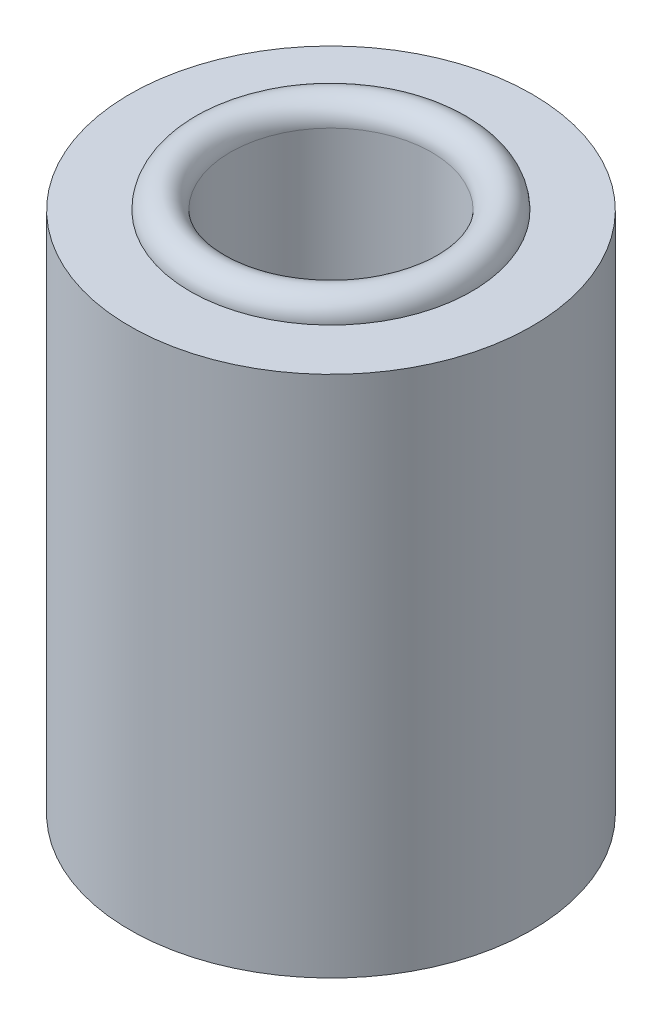
ISO-10303-21;
HEADER;
FILE_DESCRIPTION(('STEP AP214'),'2;1');
FILE_NAME('part.step','',(''),(''),'','','');
FILE_SCHEMA(('AUTOMOTIVE_DESIGN { 1 0 10303 214 1 1 1 1 }'));
ENDSEC;
DATA;
#1=APPLICATION_CONTEXT('core data for automotive mechanical design processes');
#2=APPLICATION_PROTOCOL_DEFINITION('international standard','automotive_design',2000,#1);
#3=PRODUCT_CONTEXT('',#1,'mechanical');
#4=PRODUCT('Part','Part','',(#3));
#5=PRODUCT_RELATED_PRODUCT_CATEGORY('part','',(#4));
#6=PRODUCT_DEFINITION_FORMATION('','',#4);
#7=PRODUCT_DEFINITION_CONTEXT('part definition',#1,'design');
#8=PRODUCT_DEFINITION('design','',#6,#7);
#9=PRODUCT_DEFINITION_SHAPE('','',#8);
#10=(LENGTH_UNIT() NAMED_UNIT(*) SI_UNIT(.MILLI.,.METRE.));
#11=(NAMED_UNIT(*) PLANE_ANGLE_UNIT() SI_UNIT($,.RADIAN.));
#12=(NAMED_UNIT(*) SI_UNIT($,.STERADIAN.) SOLID_ANGLE_UNIT());
#13=UNCERTAINTY_MEASURE_WITH_UNIT(LENGTH_MEASURE(1.E-05),#10,'distance_accuracy_value','');
#14=(GEOMETRIC_REPRESENTATION_CONTEXT(3) GLOBAL_UNCERTAINTY_ASSIGNED_CONTEXT((#13)) GLOBAL_UNIT_ASSIGNED_CONTEXT((#10,
#11,#12)) REPRESENTATION_CONTEXT('',''));
#15=CARTESIAN_POINT('',(0.,0.,0.));
#16=DIRECTION('',(0.,0.,1.));
#17=DIRECTION('',(1.,0.,0.));
#18=AXIS2_PLACEMENT_3D('',#15,#16,#17);
#19=CARTESIAN_POINT('',(0.,0.,0.));
#20=DIRECTION('',(0.,1.,0.));
#21=DIRECTION('',(0.,0.,1.));
#22=AXIS2_PLACEMENT_3D('',#19,#20,#21);
#23=TOROIDAL_SURFACE('',#22,6.,1.);
#24=CARTESIAN_POINT('',(0.,0.,0.));
#25=DIRECTION('',(0.,1.,0.));
#26=DIRECTION('',(0.,0.,1.));
#27=AXIS2_PLACEMENT_3D('',#24,#25,#26);
#28=CIRCLE('',#27,7.);
#29=CARTESIAN_POINT('',(0.,0.,7.));
#30=VERTEX_POINT('',#29);
#31=EDGE_CURVE('E55',#30,#30,#28,.T.);
#32=ORIENTED_EDGE('',*,*,#31,.F.);
#33=EDGE_LOOP('',(#32));
#34=FACE_BOUND('',#33,.T.);
#35=CARTESIAN_POINT('',(0.,0.,0.));
#36=DIRECTION('',(0.,1.,0.));
#37=DIRECTION('',(0.,0.,1.));
#38=AXIS2_PLACEMENT_3D('',#35,#36,#37);
#39=CIRCLE('',#38,5.);
#40=CARTESIAN_POINT('',(0.,0.,-5.));
#41=VERTEX_POINT('',#40);
#42=EDGE_CURVE('E10',#41,#41,#39,.F.);
#43=ORIENTED_EDGE('',*,*,#42,.F.);
#44=EDGE_LOOP('',(#43));
#45=FACE_BOUND('',#44,.T.);
#46=ADVANCED_FACE('F32',(#34,#45),#23,.T.);
#47=CARTESIAN_POINT('',(0.,26.,0.));
#48=DIRECTION('',(0.,1.,0.));
#49=DIRECTION('',(0.,0.,1.));
#50=AXIS2_PLACEMENT_3D('',#47,#48,#49);
#51=TOROIDAL_SURFACE('',#50,6.,1.);
#52=CARTESIAN_POINT('',(0.,26.,0.));
#53=DIRECTION('',(0.,1.,0.));
#54=DIRECTION('',(0.,0.,1.));
#55=AXIS2_PLACEMENT_3D('',#52,#53,#54);
#56=CIRCLE('',#55,7.);
#57=CARTESIAN_POINT('',(0.,26.,7.));
#58=VERTEX_POINT('',#57);
#59=EDGE_CURVE('E51',#58,#58,#56,.T.);
#60=ORIENTED_EDGE('',*,*,#59,.T.);
#61=EDGE_LOOP('',(#60));
#62=FACE_BOUND('',#61,.T.);
#63=CARTESIAN_POINT('',(0.,26.,0.));
#64=DIRECTION('',(0.,1.,0.));
#65=DIRECTION('',(0.,0.,1.));
#66=AXIS2_PLACEMENT_3D('',#63,#64,#65);
#67=CIRCLE('',#66,5.);
#68=CARTESIAN_POINT('',(0.,26.,-5.));
#69=VERTEX_POINT('',#68);
#70=EDGE_CURVE('E39',#69,#69,#67,.T.);
#71=ORIENTED_EDGE('',*,*,#70,.F.);
#72=EDGE_LOOP('',(#71));
#73=FACE_BOUND('',#72,.T.);
#74=ADVANCED_FACE('F64',(#62,#73),#51,.T.);
#75=CARTESIAN_POINT('',(0.,26.,0.));
#76=DIRECTION('',(0.,1.,0.));
#77=DIRECTION('',(0.,0.,1.));
#78=AXIS2_PLACEMENT_3D('',#75,#76,#77);
#79=PLANE('',#78);
#80=CARTESIAN_POINT('',(0.,26.,0.));
#81=DIRECTION('',(0.,1.,0.));
#82=DIRECTION('',(0.,0.,1.));
#83=AXIS2_PLACEMENT_3D('',#80,#81,#82);
#84=CIRCLE('',#83,10.);
#85=CARTESIAN_POINT('',(0.,26.,-10.));
#86=VERTEX_POINT('',#85);
#87=EDGE_CURVE('E43',#86,#86,#84,.T.);
#88=ORIENTED_EDGE('',*,*,#87,.T.);
#89=EDGE_LOOP('',(#88));
#90=FACE_BOUND('',#89,.T.);
#91=ORIENTED_EDGE('',*,*,#59,.F.);
#92=EDGE_LOOP('',(#91));
#93=FACE_BOUND('',#92,.T.);
#94=ADVANCED_FACE('F68',(#90,#93),#79,.T.);
#95=CARTESIAN_POINT('',(0.,0.,0.));
#96=DIRECTION('',(0.,1.,0.));
#97=DIRECTION('',(0.,0.,1.));
#98=AXIS2_PLACEMENT_3D('',#95,#96,#97);
#99=PLANE('',#98);
#100=ORIENTED_EDGE('',*,*,#31,.T.);
#101=EDGE_LOOP('',(#100));
#102=FACE_BOUND('',#101,.T.);
#103=CARTESIAN_POINT('',(0.,0.,0.));
#104=DIRECTION('',(0.,1.,0.));
#105=DIRECTION('',(0.,0.,1.));
#106=AXIS2_PLACEMENT_3D('',#103,#104,#105);
#107=CIRCLE('',#106,10.);
#108=CARTESIAN_POINT('',(0.,0.,-10.));
#109=VERTEX_POINT('',#108);
#110=EDGE_CURVE('E47',#109,#109,#107,.T.);
#111=ORIENTED_EDGE('',*,*,#110,.F.);
#112=EDGE_LOOP('',(#111));
#113=FACE_BOUND('',#112,.T.);
#114=ADVANCED_FACE('F59',(#102,#113),#99,.F.);
#115=CARTESIAN_POINT('',(0.,26.,0.));
#116=DIRECTION('',(0.,-1.,0.));
#117=DIRECTION('',(0.,0.,-1.));
#118=AXIS2_PLACEMENT_3D('',#115,#116,#117);
#119=CYLINDRICAL_SURFACE('',#118,10.);
#120=CARTESIAN_POINT('',(0.,26.,-10.));
#121=CARTESIAN_POINT('',(0.,25.7291666666667,-10.));
#122=CARTESIAN_POINT('',(0.,25.4583333333333,-10.));
#123=CARTESIAN_POINT('',(0.,24.9166666666667,-10.));
#124=CARTESIAN_POINT('',(0.,24.6458333333333,-10.));
#125=CARTESIAN_POINT('',(0.,24.1041666666667,-10.));
#126=CARTESIAN_POINT('',(0.,23.8333333333333,-10.));
#127=CARTESIAN_POINT('',(0.,23.2916666666667,-10.));
#128=CARTESIAN_POINT('',(0.,23.0208333333333,-10.));
#129=CARTESIAN_POINT('',(0.,22.4791666666667,-10.));
#130=CARTESIAN_POINT('',(0.,22.2083333333333,-10.));
#131=CARTESIAN_POINT('',(0.,21.6666666666667,-10.));
#132=CARTESIAN_POINT('',(0.,21.3958333333333,-10.));
#133=CARTESIAN_POINT('',(0.,20.8541666666667,-10.));
#134=CARTESIAN_POINT('',(0.,20.5833333333333,-10.));
#135=CARTESIAN_POINT('',(0.,20.0416666666667,-10.));
#136=CARTESIAN_POINT('',(0.,19.7708333333333,-10.));
#137=CARTESIAN_POINT('',(0.,19.2291666666667,-10.));
#138=CARTESIAN_POINT('',(0.,18.9583333333333,-10.));
#139=CARTESIAN_POINT('',(0.,18.4166666666667,-10.));
#140=CARTESIAN_POINT('',(0.,18.1458333333333,-10.));
#141=CARTESIAN_POINT('',(0.,17.6041666666667,-10.));
#142=CARTESIAN_POINT('',(0.,17.3333333333333,-10.));
#143=CARTESIAN_POINT('',(0.,16.7916666666667,-10.));
#144=CARTESIAN_POINT('',(0.,16.5208333333333,-10.));
#145=CARTESIAN_POINT('',(0.,15.9791666666667,-10.));
#146=CARTESIAN_POINT('',(0.,15.7083333333333,-10.));
#147=CARTESIAN_POINT('',(0.,15.1666666666667,-10.));
#148=CARTESIAN_POINT('',(0.,14.8958333333333,-10.));
#149=CARTESIAN_POINT('',(0.,14.3541666666667,-10.));
#150=CARTESIAN_POINT('',(0.,14.0833333333333,-10.));
#151=CARTESIAN_POINT('',(0.,13.5416666666667,-10.));
#152=CARTESIAN_POINT('',(0.,13.2708333333333,-10.));
#153=CARTESIAN_POINT('',(0.,12.7291666666667,-10.));
#154=CARTESIAN_POINT('',(0.,12.4583333333333,-10.));
#155=CARTESIAN_POINT('',(0.,11.9166666666667,-10.));
#156=CARTESIAN_POINT('',(0.,11.6458333333333,-10.));
#157=CARTESIAN_POINT('',(0.,11.1041666666667,-10.));
#158=CARTESIAN_POINT('',(0.,10.8333333333333,-10.));
#159=CARTESIAN_POINT('',(0.,10.2916666666667,-10.));
#160=CARTESIAN_POINT('',(0.,10.0208333333333,-10.));
#161=CARTESIAN_POINT('',(0.,9.47916666666667,-10.));
#162=CARTESIAN_POINT('',(0.,9.20833333333333,-10.));
#163=CARTESIAN_POINT('',(0.,8.66666666666667,-10.));
#164=CARTESIAN_POINT('',(0.,8.39583333333333,-10.));
#165=CARTESIAN_POINT('',(0.,7.85416666666667,-10.));
#166=CARTESIAN_POINT('',(0.,7.58333333333333,-10.));
#167=CARTESIAN_POINT('',(0.,7.04166666666667,-10.));
#168=CARTESIAN_POINT('',(0.,6.77083333333333,-10.));
#169=CARTESIAN_POINT('',(0.,6.22916666666667,-10.));
#170=CARTESIAN_POINT('',(0.,5.95833333333333,-10.));
#171=CARTESIAN_POINT('',(0.,5.41666666666667,-10.));
#172=CARTESIAN_POINT('',(0.,5.14583333333333,-10.));
#173=CARTESIAN_POINT('',(0.,4.60416666666667,-10.));
#174=CARTESIAN_POINT('',(0.,4.33333333333333,-10.));
#175=CARTESIAN_POINT('',(0.,3.79166666666667,-10.));
#176=CARTESIAN_POINT('',(0.,3.52083333333333,-10.));
#177=CARTESIAN_POINT('',(0.,2.97916666666667,-10.));
#178=CARTESIAN_POINT('',(0.,2.70833333333333,-10.));
#179=CARTESIAN_POINT('',(0.,2.16666666666667,-10.));
#180=CARTESIAN_POINT('',(0.,1.89583333333333,-10.));
#181=CARTESIAN_POINT('',(0.,1.35416666666667,-10.));
#182=CARTESIAN_POINT('',(0.,1.08333333333333,-10.));
#183=CARTESIAN_POINT('',(0.,0.541666666666667,-10.));
#184=CARTESIAN_POINT('',(0.,0.270833333333334,-10.));
#185=CARTESIAN_POINT('',(0.,0.,-10.));
#186=B_SPLINE_CURVE_WITH_KNOTS('',3,(#120,#121,#122,#123,#124,#125,#126,#127,#128,#129,#130,
#131,#132,#133,#134,#135,#136,#137,#138,#139,#140,#141,#142,#143,#144,#145,#146,#147,#148,#149,
#150,#151,#152,#153,#154,#155,#156,#157,#158,#159,#160,#161,#162,#163,#164,#165,#166,#167,#168,
#169,#170,#171,#172,#173,#174,#175,#176,#177,#178,#179,#180,#181,#182,#183,#184,#185),
.UNSPECIFIED.,.F.,.F.,(4,2,2,2,2,2,2,2,2,2,2,2,2,2,2,2,2,2,2,2,2,2,2,2,2,2,2,2,2,2,2,2,4),(0.,
0.812499999999997,1.625,2.4375,3.25,4.0625,4.875,5.6875,6.5,7.3125,8.125,8.93749999999999,
9.74999999999999,10.5625,11.375,12.1875,13.,13.8125,14.625,15.4375,16.25,17.0625,17.875,18.6875,
19.5,20.3125,21.125,21.9375,22.75,23.5625,24.375,25.1875,26.),.UNSPECIFIED.);
#187=EDGE_CURVE('BSEAM80',#86,#109,#186,.T.);
#188=ORIENTED_EDGE('',*,*,#87,.F.);
#189=ORIENTED_EDGE('',*,*,#110,.T.);
#190=ORIENTED_EDGE('',*,*,#187,.T.);
#191=ORIENTED_EDGE('',*,*,#187,.F.);
#192=EDGE_LOOP('',(#188,#190,#189,#191));
#193=FACE_BOUND('',#192,.T.);
#194=ADVANCED_FACE('F80',(#193),#119,.T.);
#195=CARTESIAN_POINT('',(0.,26.,0.));
#196=DIRECTION('',(0.,-1.,0.));
#197=DIRECTION('',(0.,0.,-1.));
#198=AXIS2_PLACEMENT_3D('',#195,#196,#197);
#199=CYLINDRICAL_SURFACE('',#198,5.);
#200=CARTESIAN_POINT('',(0.,0.,-5.));
#201=CARTESIAN_POINT('',(0.,0.270833333333333,-5.));
#202=CARTESIAN_POINT('',(0.,0.541666666666667,-5.));
#203=CARTESIAN_POINT('',(0.,1.08333333333333,-5.));
#204=CARTESIAN_POINT('',(0.,1.35416666666667,-5.));
#205=CARTESIAN_POINT('',(0.,1.89583333333333,-5.));
#206=CARTESIAN_POINT('',(0.,2.16666666666667,-5.));
#207=CARTESIAN_POINT('',(0.,2.70833333333333,-5.));
#208=CARTESIAN_POINT('',(0.,2.97916666666667,-5.));
#209=CARTESIAN_POINT('',(0.,3.52083333333333,-5.));
#210=CARTESIAN_POINT('',(0.,3.79166666666667,-5.));
#211=CARTESIAN_POINT('',(0.,4.33333333333333,-5.));
#212=CARTESIAN_POINT('',(0.,4.60416666666667,-5.));
#213=CARTESIAN_POINT('',(0.,5.14583333333333,-5.));
#214=CARTESIAN_POINT('',(0.,5.41666666666667,-5.));
#215=CARTESIAN_POINT('',(0.,5.95833333333333,-5.));
#216=CARTESIAN_POINT('',(0.,6.22916666666667,-5.));
#217=CARTESIAN_POINT('',(0.,6.77083333333333,-5.));
#218=CARTESIAN_POINT('',(0.,7.04166666666667,-5.));
#219=CARTESIAN_POINT('',(0.,7.58333333333333,-5.));
#220=CARTESIAN_POINT('',(0.,7.85416666666667,-5.));
#221=CARTESIAN_POINT('',(0.,8.39583333333333,-5.));
#222=CARTESIAN_POINT('',(0.,8.66666666666667,-5.));
#223=CARTESIAN_POINT('',(0.,9.20833333333333,-5.));
#224=CARTESIAN_POINT('',(0.,9.47916666666667,-5.));
#225=CARTESIAN_POINT('',(0.,10.0208333333333,-5.));
#226=CARTESIAN_POINT('',(0.,10.2916666666667,-5.));
#227=CARTESIAN_POINT('',(0.,10.8333333333333,-5.));
#228=CARTESIAN_POINT('',(0.,11.1041666666667,-5.));
#229=CARTESIAN_POINT('',(0.,11.6458333333333,-5.));
#230=CARTESIAN_POINT('',(0.,11.9166666666667,-5.));
#231=CARTESIAN_POINT('',(0.,12.4583333333333,-5.));
#232=CARTESIAN_POINT('',(0.,12.7291666666667,-5.));
#233=CARTESIAN_POINT('',(0.,13.2708333333333,-5.));
#234=CARTESIAN_POINT('',(0.,13.5416666666667,-5.));
#235=CARTESIAN_POINT('',(0.,14.0833333333333,-5.));
#236=CARTESIAN_POINT('',(0.,14.3541666666667,-5.));
#237=CARTESIAN_POINT('',(0.,14.8958333333333,-5.));
#238=CARTESIAN_POINT('',(0.,15.1666666666667,-5.));
#239=CARTESIAN_POINT('',(0.,15.7083333333333,-5.));
#240=CARTESIAN_POINT('',(0.,15.9791666666667,-5.));
#241=CARTESIAN_POINT('',(0.,16.5208333333333,-5.));
#242=CARTESIAN_POINT('',(0.,16.7916666666667,-5.));
#243=CARTESIAN_POINT('',(0.,17.3333333333333,-5.));
#244=CARTESIAN_POINT('',(0.,17.6041666666667,-5.));
#245=CARTESIAN_POINT('',(0.,18.1458333333333,-5.));
#246=CARTESIAN_POINT('',(0.,18.4166666666667,-5.));
#247=CARTESIAN_POINT('',(0.,18.9583333333333,-5.));
#248=CARTESIAN_POINT('',(0.,19.2291666666667,-5.));
#249=CARTESIAN_POINT('',(0.,19.7708333333333,-5.));
#250=CARTESIAN_POINT('',(0.,20.0416666666667,-5.));
#251=CARTESIAN_POINT('',(0.,20.5833333333333,-5.));
#252=CARTESIAN_POINT('',(0.,20.8541666666667,-5.));
#253=CARTESIAN_POINT('',(0.,21.3958333333333,-5.));
#254=CARTESIAN_POINT('',(0.,21.6666666666667,-5.));
#255=CARTESIAN_POINT('',(0.,22.2083333333333,-5.));
#256=CARTESIAN_POINT('',(0.,22.4791666666667,-5.));
#257=CARTESIAN_POINT('',(0.,23.0208333333333,-5.));
#258=CARTESIAN_POINT('',(0.,23.2916666666667,-5.));
#259=CARTESIAN_POINT('',(0.,23.8333333333333,-5.));
#260=CARTESIAN_POINT('',(0.,24.1041666666667,-5.));
#261=CARTESIAN_POINT('',(0.,24.6458333333333,-5.));
#262=CARTESIAN_POINT('',(0.,24.9166666666667,-5.));
#263=CARTESIAN_POINT('',(0.,25.4583333333333,-5.));
#264=CARTESIAN_POINT('',(0.,25.7291666666667,-5.));
#265=CARTESIAN_POINT('',(0.,26.,-5.));
#266=B_SPLINE_CURVE_WITH_KNOTS('',3,(#200,#201,#202,#203,#204,#205,#206,#207,#208,#209,#210,
#211,#212,#213,#214,#215,#216,#217,#218,#219,#220,#221,#222,#223,#224,#225,#226,#227,#228,#229,
#230,#231,#232,#233,#234,#235,#236,#237,#238,#239,#240,#241,#242,#243,#244,#245,#246,#247,#248,
#249,#250,#251,#252,#253,#254,#255,#256,#257,#258,#259,#260,#261,#262,#263,#264,#265),
.UNSPECIFIED.,.F.,.F.,(4,2,2,2,2,2,2,2,2,2,2,2,2,2,2,2,2,2,2,2,2,2,2,2,2,2,2,2,2,2,2,2,4),(0.,
0.812500000000001,1.625,2.4375,3.25,4.0625,4.875,5.6875,6.5,7.3125,8.125,8.9375,9.75,10.5625,
11.375,12.1875,13.,13.8125,14.625,15.4375,16.25,17.0625,17.875,18.6875,19.5,20.3125,21.125,
21.9375,22.75,23.5625,24.375,25.1875,26.),.UNSPECIFIED.);
#267=EDGE_CURVE('BSEAM83',#41,#69,#266,.T.);
#268=ORIENTED_EDGE('',*,*,#42,.T.);
#269=ORIENTED_EDGE('',*,*,#70,.T.);
#270=ORIENTED_EDGE('',*,*,#267,.T.);
#271=ORIENTED_EDGE('',*,*,#267,.F.);
#272=EDGE_LOOP('',(#268,#270,#269,#271));
#273=FACE_BOUND('',#272,.T.);
#274=ADVANCED_FACE('F83',(#273),#199,.F.);
#275=CLOSED_SHELL('',(#46,#74,#94,#114,#194,#274));
#276=MANIFOLD_SOLID_BREP('B2',#275);
#277=ADVANCED_BREP_SHAPE_REPRESENTATION('',(#18,#276),#14);
#278=SHAPE_DEFINITION_REPRESENTATION(#9,#277);
ENDSEC;
END-ISO-10303-21;
